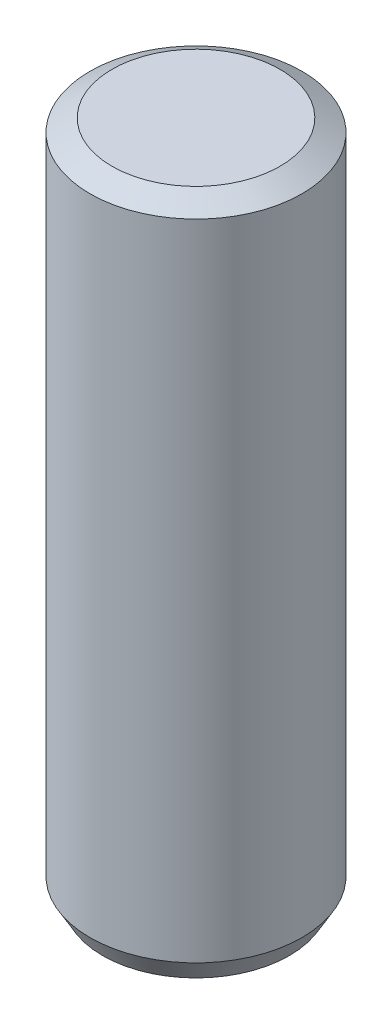
ISO-10303-21;
HEADER;
FILE_DESCRIPTION(('STEP AP214'),'2;1');
FILE_NAME('part.step','',(''),(''),'','','');
FILE_SCHEMA(('AUTOMOTIVE_DESIGN { 1 0 10303 214 1 1 1 1 }'));
ENDSEC;
DATA;
#1=APPLICATION_CONTEXT('core data for automotive mechanical design processes');
#2=APPLICATION_PROTOCOL_DEFINITION('international standard','automotive_design',2000,#1);
#3=PRODUCT_CONTEXT('',#1,'mechanical');
#4=PRODUCT('Part','Part','',(#3));
#5=PRODUCT_RELATED_PRODUCT_CATEGORY('part','',(#4));
#6=PRODUCT_DEFINITION_FORMATION('','',#4);
#7=PRODUCT_DEFINITION_CONTEXT('part definition',#1,'design');
#8=PRODUCT_DEFINITION('design','',#6,#7);
#9=PRODUCT_DEFINITION_SHAPE('','',#8);
#10=(LENGTH_UNIT() NAMED_UNIT(*) SI_UNIT(.MILLI.,.METRE.));
#11=(NAMED_UNIT(*) PLANE_ANGLE_UNIT() SI_UNIT($,.RADIAN.));
#12=(NAMED_UNIT(*) SI_UNIT($,.STERADIAN.) SOLID_ANGLE_UNIT());
#13=UNCERTAINTY_MEASURE_WITH_UNIT(LENGTH_MEASURE(1.E-05),#10,'distance_accuracy_value','');
#14=(GEOMETRIC_REPRESENTATION_CONTEXT(3) GLOBAL_UNCERTAINTY_ASSIGNED_CONTEXT((#13)) GLOBAL_UNIT_ASSIGNED_CONTEXT((#10,
#11,#12)) REPRESENTATION_CONTEXT('',''));
#15=CARTESIAN_POINT('',(0.,0.,0.));
#16=DIRECTION('',(0.,0.,1.));
#17=DIRECTION('',(1.,0.,0.));
#18=AXIS2_PLACEMENT_3D('',#15,#16,#17);
#19=CARTESIAN_POINT('',(0.,16.,0.));
#20=DIRECTION('',(0.,-1.,0.));
#21=DIRECTION('',(0.,0.,-1.));
#22=AXIS2_PLACEMENT_3D('',#19,#20,#21);
#23=CYLINDRICAL_SURFACE('',#22,2.5);
#24=CARTESIAN_POINT('',(0.,0.519615242270659,0.));
#25=DIRECTION('',(0.,1.,0.));
#26=DIRECTION('',(0.,0.,1.));
#27=AXIS2_PLACEMENT_3D('',#24,#25,#26);
#28=CIRCLE('',#27,2.5);
#29=CARTESIAN_POINT('',(0.,0.519615242270659,2.5));
#30=VERTEX_POINT('',#29);
#31=EDGE_CURVE('E59',#30,#30,#28,.T.);
#32=ORIENTED_EDGE('',*,*,#31,.T.);
#33=EDGE_LOOP('',(#32));
#34=FACE_BOUND('',#33,.T.);
#35=CARTESIAN_POINT('',(0.,15.7,0.));
#36=DIRECTION('',(0.,1.,0.));
#37=DIRECTION('',(0.,0.,1.));
#38=AXIS2_PLACEMENT_3D('',#35,#36,#37);
#39=CIRCLE('',#38,2.5);
#40=CARTESIAN_POINT('',(0.,15.7,2.5));
#41=VERTEX_POINT('',#40);
#42=EDGE_CURVE('E63',#41,#41,#39,.F.);
#43=ORIENTED_EDGE('',*,*,#42,.T.);
#44=EDGE_LOOP('',(#43));
#45=FACE_BOUND('',#44,.T.);
#46=ADVANCED_FACE('F47',(#34,#45),#23,.T.);
#47=CARTESIAN_POINT('',(0.,16.,0.));
#48=DIRECTION('',(0.,1.,0.));
#49=DIRECTION('',(0.,0.,1.));
#50=AXIS2_PLACEMENT_3D('',#47,#48,#49);
#51=PLANE('',#50);
#52=CARTESIAN_POINT('',(0.,16.,0.));
#53=DIRECTION('',(0.,1.,0.));
#54=DIRECTION('',(0.,0.,1.));
#55=AXIS2_PLACEMENT_3D('',#52,#53,#54);
#56=CIRCLE('',#55,1.98038475772934);
#57=CARTESIAN_POINT('',(0.,16.,1.98038475772934));
#58=VERTEX_POINT('',#57);
#59=EDGE_CURVE('E10',#58,#58,#56,.T.);
#60=ORIENTED_EDGE('',*,*,#59,.T.);
#61=EDGE_LOOP('',(#60));
#62=FACE_BOUND('',#61,.T.);
#63=ADVANCED_FACE('F79',(#62),#51,.T.);
#64=CARTESIAN_POINT('',(0.,0.,0.));
#65=DIRECTION('',(0.,1.,0.));
#66=DIRECTION('',(0.,0.,1.));
#67=AXIS2_PLACEMENT_3D('',#64,#65,#66);
#68=PLANE('',#67);
#69=CARTESIAN_POINT('',(0.,0.,0.));
#70=DIRECTION('',(0.,1.,0.));
#71=DIRECTION('',(0.,0.,1.));
#72=AXIS2_PLACEMENT_3D('',#69,#70,#71);
#73=CIRCLE('',#72,2.2);
#74=CARTESIAN_POINT('',(0.,0.,2.2));
#75=VERTEX_POINT('',#74);
#76=EDGE_CURVE('E55',#75,#75,#73,.F.);
#77=ORIENTED_EDGE('',*,*,#76,.T.);
#78=EDGE_LOOP('',(#77));
#79=FACE_BOUND('',#78,.T.);
#80=ADVANCED_FACE('F76',(#79),#68,.F.);
#81=CARTESIAN_POINT('',(0.,0.519615242270659,0.));
#82=DIRECTION('',(0.,1.,0.));
#83=DIRECTION('',(0.,0.,1.));
#84=AXIS2_PLACEMENT_3D('',#81,#82,#83);
#85=CONICAL_SURFACE('',#84,2.5,0.523598775598299);
#86=ORIENTED_EDGE('',*,*,#76,.F.);
#87=EDGE_LOOP('',(#86));
#88=FACE_BOUND('',#87,.T.);
#89=ORIENTED_EDGE('',*,*,#31,.F.);
#90=EDGE_LOOP('',(#89));
#91=FACE_BOUND('',#90,.T.);
#92=ADVANCED_FACE('F72',(#88,#91),#85,.T.);
#93=CARTESIAN_POINT('',(0.,16.,0.));
#94=DIRECTION('',(0.,-1.,0.));
#95=DIRECTION('',(0.,0.,-1.));
#96=AXIS2_PLACEMENT_3D('',#93,#94,#95);
#97=CONICAL_SURFACE('',#96,1.98038475772934,1.0471975511966);
#98=ORIENTED_EDGE('',*,*,#42,.F.);
#99=EDGE_LOOP('',(#98));
#100=FACE_BOUND('',#99,.T.);
#101=ORIENTED_EDGE('',*,*,#59,.F.);
#102=EDGE_LOOP('',(#101));
#103=FACE_BOUND('',#102,.T.);
#104=ADVANCED_FACE('F50',(#100,#103),#97,.T.);
#105=CLOSED_SHELL('',(#46,#63,#80,#92,#104));
#106=MANIFOLD_SOLID_BREP('B2',#105);
#107=ADVANCED_BREP_SHAPE_REPRESENTATION('',(#18,#106),#14);
#108=SHAPE_DEFINITION_REPRESENTATION(#9,#107);
ENDSEC;
END-ISO-10303-21;
